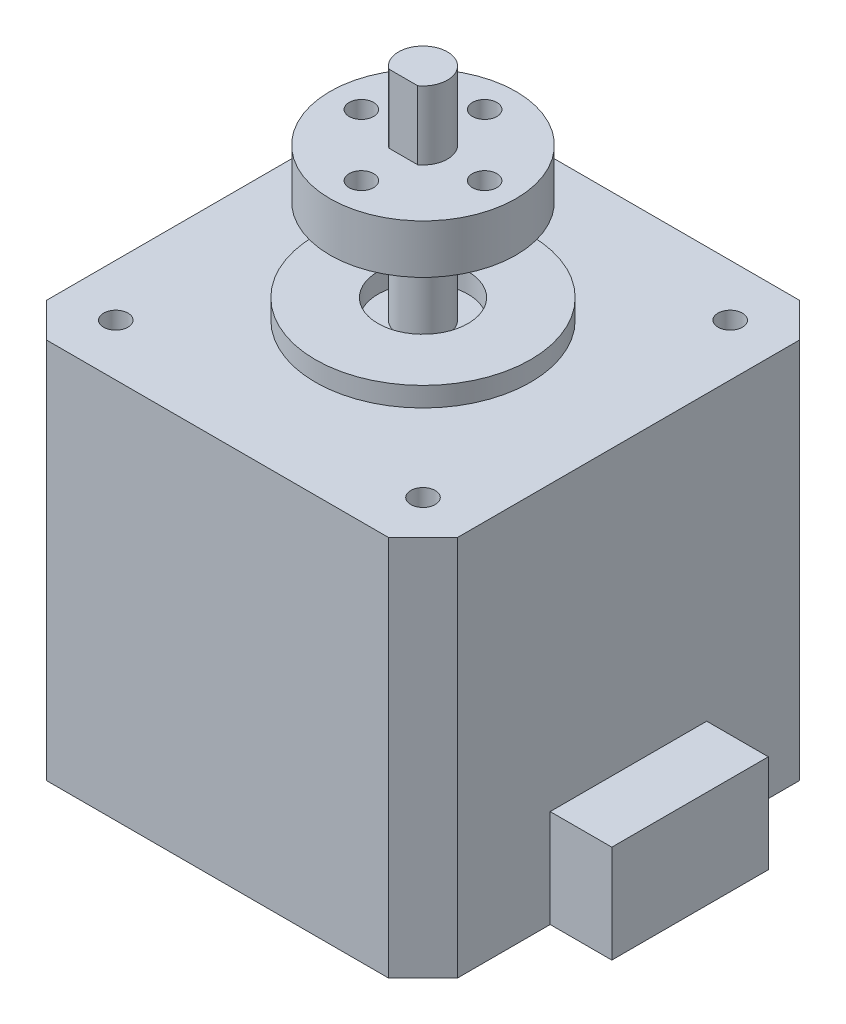
ISO-10303-21;
HEADER;
FILE_DESCRIPTION(('STEP AP214'),'2;1');
FILE_NAME('part.step','',(''),(''),'','','');
FILE_SCHEMA(('AUTOMOTIVE_DESIGN { 1 0 10303 214 1 1 1 1 }'));
ENDSEC;
DATA;
#1=APPLICATION_CONTEXT('core data for automotive mechanical design processes');
#2=APPLICATION_PROTOCOL_DEFINITION('international standard','automotive_design',2000,#1);
#3=PRODUCT_CONTEXT('',#1,'mechanical');
#4=PRODUCT('Part','Part','',(#3));
#5=PRODUCT_RELATED_PRODUCT_CATEGORY('part','',(#4));
#6=PRODUCT_DEFINITION_FORMATION('','',#4);
#7=PRODUCT_DEFINITION_CONTEXT('part definition',#1,'design');
#8=PRODUCT_DEFINITION('design','',#6,#7);
#9=PRODUCT_DEFINITION_SHAPE('','',#8);
#10=(LENGTH_UNIT() NAMED_UNIT(*) SI_UNIT(.MILLI.,.METRE.));
#11=(NAMED_UNIT(*) PLANE_ANGLE_UNIT() SI_UNIT($,.RADIAN.));
#12=(NAMED_UNIT(*) SI_UNIT($,.STERADIAN.) SOLID_ANGLE_UNIT());
#13=UNCERTAINTY_MEASURE_WITH_UNIT(LENGTH_MEASURE(1.E-05),#10,'distance_accuracy_value','');
#14=(GEOMETRIC_REPRESENTATION_CONTEXT(3) GLOBAL_UNCERTAINTY_ASSIGNED_CONTEXT((#13)) GLOBAL_UNIT_ASSIGNED_CONTEXT((#10,
#11,#12)) REPRESENTATION_CONTEXT('',''));
#15=CARTESIAN_POINT('',(0.,0.,0.));
#16=DIRECTION('',(0.,0.,1.));
#17=DIRECTION('',(1.,0.,0.));
#18=AXIS2_PLACEMENT_3D('',#15,#16,#17);
#19=CARTESIAN_POINT('',(42.,39.,-41.0140242480115));
#20=DIRECTION('',(-1.,0.,0.));
#21=DIRECTION('',(0.,0.,1.));
#22=AXIS2_PLACEMENT_3D('',#19,#20,#21);
#23=PLANE('',#22);
#24=DIRECTION('',(0.,-1.,0.));
#25=VECTOR('',#24,1.);
#26=CARTESIAN_POINT('',(42.,0.,-15.5490242480115));
#27=LINE('',#26,#25);
#28=CARTESIAN_POINT('',(42.,10.,-15.5490242480115));
#29=VERTEX_POINT('',#28);
#30=CARTESIAN_POINT('',(42.,0.,-15.5490242480115));
#31=VERTEX_POINT('',#30);
#32=EDGE_CURVE('E51',#29,#31,#27,.T.);
#33=ORIENTED_EDGE('',*,*,#32,.F.);
#34=DIRECTION('',(0.,0.,1.));
#35=VECTOR('',#34,1.);
#36=CARTESIAN_POINT('',(42.,10.,-15.5490242480115));
#37=LINE('',#36,#35);
#38=CARTESIAN_POINT('',(42.,10.,-31.5490242480115));
#39=VERTEX_POINT('',#38);
#40=EDGE_CURVE('E157',#39,#29,#37,.T.);
#41=ORIENTED_EDGE('',*,*,#40,.F.);
#42=DIRECTION('',(0.,1.,0.));
#43=VECTOR('',#42,1.);
#44=CARTESIAN_POINT('',(42.,0.,-31.5490242480115));
#45=LINE('',#44,#43);
#46=CARTESIAN_POINT('',(42.,0.,-31.5490242480115));
#47=VERTEX_POINT('',#46);
#48=EDGE_CURVE('E57',#47,#39,#45,.T.);
#49=ORIENTED_EDGE('',*,*,#48,.F.);
#50=DIRECTION('',(0.,0.,-1.));
#51=VECTOR('',#50,1.);
#52=CARTESIAN_POINT('',(42.,0.,-41.0140242480115));
#53=LINE('',#52,#51);
#54=CARTESIAN_POINT('',(42.,0.,-41.0140242480115));
#55=VERTEX_POINT('',#54);
#56=EDGE_CURVE('E265',#47,#55,#53,.T.);
#57=ORIENTED_EDGE('',*,*,#56,.T.);
#58=DIRECTION('',(0.,-1.,0.));
#59=VECTOR('',#58,1.);
#60=CARTESIAN_POINT('',(42.,39.,-41.0140242480115));
#61=LINE('',#60,#59);
#62=CARTESIAN_POINT('',(42.,39.,-41.0140242480115));
#63=VERTEX_POINT('',#62);
#64=EDGE_CURVE('E291',#63,#55,#61,.T.);
#65=ORIENTED_EDGE('',*,*,#64,.F.);
#66=DIRECTION('',(0.,0.,-1.));
#67=VECTOR('',#66,1.);
#68=CARTESIAN_POINT('',(42.,39.,-41.0140242480115));
#69=LINE('',#68,#67);
#70=CARTESIAN_POINT('',(42.,39.,-6.085092059877));
#71=VERTEX_POINT('',#70);
#72=EDGE_CURVE('E248',#71,#63,#69,.T.);
#73=ORIENTED_EDGE('',*,*,#72,.F.);
#74=DIRECTION('',(0.,-1.,0.));
#75=VECTOR('',#74,1.);
#76=CARTESIAN_POINT('',(42.,39.,-6.085092059877));
#77=LINE('',#76,#75);
#78=CARTESIAN_POINT('',(42.,0.,-6.085092059877));
#79=VERTEX_POINT('',#78);
#80=EDGE_CURVE('E294',#71,#79,#77,.T.);
#81=ORIENTED_EDGE('',*,*,#80,.T.);
#82=EDGE_CURVE('E266',#79,#31,#53,.T.);
#83=ORIENTED_EDGE('',*,*,#82,.T.);
#84=EDGE_LOOP('',(#33,#41,#49,#57,#65,#73,#81,#83));
#85=FACE_BOUND('',#84,.T.);
#86=ADVANCED_FACE('F34',(#85),#23,.F.);
#87=CARTESIAN_POINT('',(38.4644660940673,39.,-2.54955815394427));
#88=DIRECTION('',(0.,0.,-1.));
#89=DIRECTION('',(-1.,0.,0.));
#90=AXIS2_PLACEMENT_3D('',#87,#88,#89);
#91=PLANE('',#90);
#92=DIRECTION('',(1.,0.,0.));
#93=VECTOR('',#92,1.);
#94=CARTESIAN_POINT('',(38.4644660940673,0.,-2.54955815394427));
#95=LINE('',#94,#93);
#96=CARTESIAN_POINT('',(3.53553390593273,0.,-2.54955815394426));
#97=VERTEX_POINT('',#96);
#98=CARTESIAN_POINT('',(38.4644660940673,0.,-2.54955815394427));
#99=VERTEX_POINT('',#98);
#100=EDGE_CURVE('E239',#97,#99,#95,.T.);
#101=ORIENTED_EDGE('',*,*,#100,.T.);
#102=DIRECTION('',(0.,-1.,0.));
#103=VECTOR('',#102,1.);
#104=CARTESIAN_POINT('',(38.4644660940673,39.,-2.54955815394427));
#105=LINE('',#104,#103);
#106=CARTESIAN_POINT('',(38.4644660940673,39.,-2.54955815394427));
#107=VERTEX_POINT('',#106);
#108=EDGE_CURVE('E297',#107,#99,#105,.T.);
#109=ORIENTED_EDGE('',*,*,#108,.F.);
#110=DIRECTION('',(1.,0.,0.));
#111=VECTOR('',#110,1.);
#112=CARTESIAN_POINT('',(38.4644660940673,39.,-2.54955815394427));
#113=LINE('',#112,#111);
#114=CARTESIAN_POINT('',(3.53553390593273,39.,-2.54955815394426));
#115=VERTEX_POINT('',#114);
#116=EDGE_CURVE('E242',#115,#107,#113,.T.);
#117=ORIENTED_EDGE('',*,*,#116,.F.);
#118=DIRECTION('',(0.,-1.,0.));
#119=VECTOR('',#118,1.);
#120=CARTESIAN_POINT('',(3.53553390593273,39.,-2.54955815394426));
#121=LINE('',#120,#119);
#122=EDGE_CURVE('E260',#115,#97,#121,.T.);
#123=ORIENTED_EDGE('',*,*,#122,.T.);
#124=EDGE_LOOP('',(#101,#109,#117,#123));
#125=FACE_BOUND('',#124,.T.);
#126=ADVANCED_FACE('F36',(#125),#91,.F.);
#127=CARTESIAN_POINT('',(42.,39.,-6.085092059877));
#128=DIRECTION('',(-0.707106781186547,0.,-0.707106781186548));
#129=DIRECTION('',(-0.707106781186548,0.,0.707106781186547));
#130=AXIS2_PLACEMENT_3D('',#127,#128,#129);
#131=PLANE('',#130);
#132=DIRECTION('',(0.707106781186548,0.,-0.707106781186547));
#133=VECTOR('',#132,1.);
#134=CARTESIAN_POINT('',(42.,0.,-6.085092059877));
#135=LINE('',#134,#133);
#136=EDGE_CURVE('E263',#99,#79,#135,.T.);
#137=ORIENTED_EDGE('',*,*,#136,.T.);
#138=ORIENTED_EDGE('',*,*,#80,.F.);
#139=DIRECTION('',(0.707106781186548,0.,-0.707106781186547));
#140=VECTOR('',#139,1.);
#141=CARTESIAN_POINT('',(42.,39.,-6.085092059877));
#142=LINE('',#141,#140);
#143=EDGE_CURVE('E245',#107,#71,#142,.T.);
#144=ORIENTED_EDGE('',*,*,#143,.F.);
#145=ORIENTED_EDGE('',*,*,#108,.T.);
#146=EDGE_LOOP('',(#137,#138,#144,#145));
#147=FACE_BOUND('',#146,.T.);
#148=ADVANCED_FACE('F338',(#147),#131,.F.);
#149=CARTESIAN_POINT('',(38.4644660940673,39.,-44.5495581539443));
#150=DIRECTION('',(-0.707106781186549,0.,0.707106781186546));
#151=DIRECTION('',(0.707106781186546,0.,0.707106781186549));
#152=AXIS2_PLACEMENT_3D('',#149,#150,#151);
#153=PLANE('',#152);
#154=DIRECTION('',(-0.707106781186546,0.,-0.707106781186549));
#155=VECTOR('',#154,1.);
#156=CARTESIAN_POINT('',(38.4644660940673,0.,-44.5495581539443));
#157=LINE('',#156,#155);
#158=CARTESIAN_POINT('',(38.4644660940673,0.,-44.5495581539443));
#159=VERTEX_POINT('',#158);
#160=EDGE_CURVE('E268',#55,#159,#157,.T.);
#161=ORIENTED_EDGE('',*,*,#160,.T.);
#162=DIRECTION('',(0.,-1.,0.));
#163=VECTOR('',#162,1.);
#164=CARTESIAN_POINT('',(38.4644660940673,39.,-44.5495581539443));
#165=LINE('',#164,#163);
#166=CARTESIAN_POINT('',(38.4644660940673,39.,-44.5495581539443));
#167=VERTEX_POINT('',#166);
#168=EDGE_CURVE('E288',#167,#159,#165,.T.);
#169=ORIENTED_EDGE('',*,*,#168,.F.);
#170=DIRECTION('',(-0.707106781186546,0.,-0.707106781186549));
#171=VECTOR('',#170,1.);
#172=CARTESIAN_POINT('',(38.4644660940673,39.,-44.5495581539443));
#173=LINE('',#172,#171);
#174=EDGE_CURVE('E250',#63,#167,#173,.T.);
#175=ORIENTED_EDGE('',*,*,#174,.F.);
#176=ORIENTED_EDGE('',*,*,#64,.T.);
#177=EDGE_LOOP('',(#161,#169,#175,#176));
#178=FACE_BOUND('',#177,.T.);
#179=ADVANCED_FACE('F341',(#178),#153,.F.);
#180=CARTESIAN_POINT('',(3.53553390593274,39.,-44.5495581539443));
#181=DIRECTION('',(0.,0.,1.));
#182=DIRECTION('',(1.,0.,0.));
#183=AXIS2_PLACEMENT_3D('',#180,#181,#182);
#184=PLANE('',#183);
#185=DIRECTION('',(-1.,0.,0.));
#186=VECTOR('',#185,1.);
#187=CARTESIAN_POINT('',(3.53553390593274,0.,-44.5495581539443));
#188=LINE('',#187,#186);
#189=CARTESIAN_POINT('',(3.53553390593274,0.,-44.5495581539443));
#190=VERTEX_POINT('',#189);
#191=EDGE_CURVE('E270',#159,#190,#188,.T.);
#192=ORIENTED_EDGE('',*,*,#191,.T.);
#193=DIRECTION('',(0.,-1.,0.));
#194=VECTOR('',#193,1.);
#195=CARTESIAN_POINT('',(3.53553390593274,39.,-44.5495581539443));
#196=LINE('',#195,#194);
#197=CARTESIAN_POINT('',(3.53553390593274,39.,-44.5495581539443));
#198=VERTEX_POINT('',#197);
#199=EDGE_CURVE('E285',#198,#190,#196,.T.);
#200=ORIENTED_EDGE('',*,*,#199,.F.);
#201=DIRECTION('',(-1.,0.,0.));
#202=VECTOR('',#201,1.);
#203=CARTESIAN_POINT('',(3.53553390593274,39.,-44.5495581539443));
#204=LINE('',#203,#202);
#205=EDGE_CURVE('E252',#167,#198,#204,.T.);
#206=ORIENTED_EDGE('',*,*,#205,.F.);
#207=ORIENTED_EDGE('',*,*,#168,.T.);
#208=EDGE_LOOP('',(#192,#200,#206,#207));
#209=FACE_BOUND('',#208,.T.);
#210=ADVANCED_FACE('F348',(#209),#184,.F.);
#211=CARTESIAN_POINT('',(0.,39.,-41.0140242480115));
#212=DIRECTION('',(0.707106781186546,0.,0.707106781186549));
#213=DIRECTION('',(0.707106781186549,0.,-0.707106781186546));
#214=AXIS2_PLACEMENT_3D('',#211,#212,#213);
#215=PLANE('',#214);
#216=DIRECTION('',(-0.707106781186549,0.,0.707106781186546));
#217=VECTOR('',#216,1.);
#218=CARTESIAN_POINT('',(0.,0.,-41.0140242480115));
#219=LINE('',#218,#217);
#220=CARTESIAN_POINT('',(0.,0.,-41.0140242480115));
#221=VERTEX_POINT('',#220);
#222=EDGE_CURVE('E272',#190,#221,#219,.T.);
#223=ORIENTED_EDGE('',*,*,#222,.T.);
#224=DIRECTION('',(0.,-1.,0.));
#225=VECTOR('',#224,1.);
#226=CARTESIAN_POINT('',(0.,39.,-41.0140242480115));
#227=LINE('',#226,#225);
#228=CARTESIAN_POINT('',(0.,39.,-41.0140242480115));
#229=VERTEX_POINT('',#228);
#230=EDGE_CURVE('E282',#229,#221,#227,.T.);
#231=ORIENTED_EDGE('',*,*,#230,.F.);
#232=DIRECTION('',(-0.707106781186549,0.,0.707106781186546));
#233=VECTOR('',#232,1.);
#234=CARTESIAN_POINT('',(0.,39.,-41.0140242480115));
#235=LINE('',#234,#233);
#236=EDGE_CURVE('E254',#198,#229,#235,.T.);
#237=ORIENTED_EDGE('',*,*,#236,.F.);
#238=ORIENTED_EDGE('',*,*,#199,.T.);
#239=EDGE_LOOP('',(#223,#231,#237,#238));
#240=FACE_BOUND('',#239,.T.);
#241=ADVANCED_FACE('F373',(#240),#215,.F.);
#242=CARTESIAN_POINT('',(0.,39.,-6.085092059877));
#243=DIRECTION('',(1.,0.,0.));
#244=DIRECTION('',(0.,0.,-1.));
#245=AXIS2_PLACEMENT_3D('',#242,#243,#244);
#246=PLANE('',#245);
#247=DIRECTION('',(0.,0.,1.));
#248=VECTOR('',#247,1.);
#249=CARTESIAN_POINT('',(0.,0.,-6.085092059877));
#250=LINE('',#249,#248);
#251=CARTESIAN_POINT('',(0.,0.,-6.085092059877));
#252=VERTEX_POINT('',#251);
#253=EDGE_CURVE('E274',#221,#252,#250,.T.);
#254=ORIENTED_EDGE('',*,*,#253,.T.);
#255=DIRECTION('',(0.,-1.,0.));
#256=VECTOR('',#255,1.);
#257=CARTESIAN_POINT('',(0.,39.,-6.085092059877));
#258=LINE('',#257,#256);
#259=CARTESIAN_POINT('',(0.,39.,-6.085092059877));
#260=VERTEX_POINT('',#259);
#261=EDGE_CURVE('E279',#260,#252,#258,.T.);
#262=ORIENTED_EDGE('',*,*,#261,.F.);
#263=DIRECTION('',(0.,0.,1.));
#264=VECTOR('',#263,1.);
#265=CARTESIAN_POINT('',(0.,39.,-6.085092059877));
#266=LINE('',#265,#264);
#267=EDGE_CURVE('E256',#229,#260,#266,.T.);
#268=ORIENTED_EDGE('',*,*,#267,.F.);
#269=ORIENTED_EDGE('',*,*,#230,.T.);
#270=EDGE_LOOP('',(#254,#262,#268,#269));
#271=FACE_BOUND('',#270,.T.);
#272=ADVANCED_FACE('F369',(#271),#246,.F.);
#273=CARTESIAN_POINT('',(3.53553390593273,39.,-2.54955815394426));
#274=DIRECTION('',(0.707106781186549,0.,-0.707106781186546));
#275=DIRECTION('',(-0.707106781186546,0.,-0.707106781186549));
#276=AXIS2_PLACEMENT_3D('',#273,#274,#275);
#277=PLANE('',#276);
#278=DIRECTION('',(0.707106781186546,0.,0.707106781186549));
#279=VECTOR('',#278,1.);
#280=CARTESIAN_POINT('',(3.53553390593273,0.,-2.54955815394426));
#281=LINE('',#280,#279);
#282=EDGE_CURVE('E246',#252,#97,#281,.T.);
#283=ORIENTED_EDGE('',*,*,#282,.T.);
#284=ORIENTED_EDGE('',*,*,#122,.F.);
#285=DIRECTION('',(0.707106781186546,0.,0.707106781186549));
#286=VECTOR('',#285,1.);
#287=CARTESIAN_POINT('',(3.53553390593273,39.,-2.54955815394426));
#288=LINE('',#287,#286);
#289=EDGE_CURVE('E258',#260,#115,#288,.T.);
#290=ORIENTED_EDGE('',*,*,#289,.F.);
#291=ORIENTED_EDGE('',*,*,#261,.T.);
#292=EDGE_LOOP('',(#283,#284,#290,#291));
#293=FACE_BOUND('',#292,.T.);
#294=ADVANCED_FACE('F365',(#293),#277,.F.);
#295=CARTESIAN_POINT('',(0.,39.,0.));
#296=DIRECTION('',(0.,-1.,0.));
#297=DIRECTION('',(0.,0.,-1.));
#298=AXIS2_PLACEMENT_3D('',#295,#296,#297);
#299=PLANE('',#298);
#300=CARTESIAN_POINT('',(21.,39.,-23.5495581539443));
#301=DIRECTION('',(0.,-1.,0.));
#302=DIRECTION('',(0.,0.,-1.));
#303=AXIS2_PLACEMENT_3D('',#300,#301,#302);
#304=CIRCLE('',#303,11.);
#305=CARTESIAN_POINT('',(21.,39.,-34.5495581539443));
#306=VERTEX_POINT('',#305);
#307=EDGE_CURVE('E43',#306,#306,#304,.F.);
#308=ORIENTED_EDGE('',*,*,#307,.F.);
#309=EDGE_LOOP('',(#308));
#310=FACE_BOUND('',#309,.T.);
#311=CARTESIAN_POINT('',(5.3,39.,-7.84955815394426));
#312=DIRECTION('',(0.,1.,0.));
#313=DIRECTION('',(0.,0.,1.));
#314=AXIS2_PLACEMENT_3D('',#311,#312,#313);
#315=CIRCLE('',#314,1.25);
#316=CARTESIAN_POINT('',(5.3,39.,-6.59955815394426));
#317=VERTEX_POINT('',#316);
#318=EDGE_CURVE('E217',#317,#317,#315,.T.);
#319=ORIENTED_EDGE('',*,*,#318,.F.);
#320=EDGE_LOOP('',(#319));
#321=FACE_BOUND('',#320,.T.);
#322=CARTESIAN_POINT('',(36.7,39.,-7.84955815394426));
#323=DIRECTION('',(0.,1.,0.));
#324=DIRECTION('',(0.,0.,1.));
#325=AXIS2_PLACEMENT_3D('',#322,#323,#324);
#326=CIRCLE('',#325,1.25);
#327=CARTESIAN_POINT('',(36.7,39.,-6.59955815394426));
#328=VERTEX_POINT('',#327);
#329=EDGE_CURVE('E228',#328,#328,#326,.T.);
#330=ORIENTED_EDGE('',*,*,#329,.F.);
#331=EDGE_LOOP('',(#330));
#332=FACE_BOUND('',#331,.T.);
#333=CARTESIAN_POINT('',(36.7,39.,-39.2495581539443));
#334=DIRECTION('',(0.,1.,0.));
#335=DIRECTION('',(0.,0.,1.));
#336=AXIS2_PLACEMENT_3D('',#333,#334,#335);
#337=CIRCLE('',#336,1.25);
#338=CARTESIAN_POINT('',(36.7,39.,-37.9995581539443));
#339=VERTEX_POINT('',#338);
#340=EDGE_CURVE('E222',#339,#339,#337,.T.);
#341=ORIENTED_EDGE('',*,*,#340,.F.);
#342=EDGE_LOOP('',(#341));
#343=FACE_BOUND('',#342,.T.);
#344=CARTESIAN_POINT('',(5.3,39.,-39.2495581539443));
#345=DIRECTION('',(0.,1.,0.));
#346=DIRECTION('',(0.,0.,1.));
#347=AXIS2_PLACEMENT_3D('',#344,#345,#346);
#348=CIRCLE('',#347,1.25);
#349=CARTESIAN_POINT('',(5.3,39.,-37.9995581539443));
#350=VERTEX_POINT('',#349);
#351=EDGE_CURVE('E221',#350,#350,#348,.T.);
#352=ORIENTED_EDGE('',*,*,#351,.F.);
#353=EDGE_LOOP('',(#352));
#354=FACE_BOUND('',#353,.T.);
#355=ORIENTED_EDGE('',*,*,#116,.T.);
#356=ORIENTED_EDGE('',*,*,#143,.T.);
#357=ORIENTED_EDGE('',*,*,#72,.T.);
#358=ORIENTED_EDGE('',*,*,#174,.T.);
#359=ORIENTED_EDGE('',*,*,#205,.T.);
#360=ORIENTED_EDGE('',*,*,#236,.T.);
#361=ORIENTED_EDGE('',*,*,#267,.T.);
#362=ORIENTED_EDGE('',*,*,#289,.T.);
#363=EDGE_LOOP('',(#355,#356,#357,#358,#359,#360,#361,#362));
#364=FACE_BOUND('',#363,.T.);
#365=ADVANCED_FACE('F356',(#310,#321,#332,#343,#354,#364),#299,.F.);
#366=CARTESIAN_POINT('',(0.,0.,0.));
#367=DIRECTION('',(0.,-1.,0.));
#368=DIRECTION('',(0.,0.,-1.));
#369=AXIS2_PLACEMENT_3D('',#366,#367,#368);
#370=PLANE('',#369);
#371=CARTESIAN_POINT('',(5.3,0.,-7.84955815394426));
#372=DIRECTION('',(0.,1.,0.));
#373=DIRECTION('',(0.,0.,1.));
#374=AXIS2_PLACEMENT_3D('',#371,#372,#373);
#375=CIRCLE('',#374,1.25);
#376=CARTESIAN_POINT('',(5.3,0.,-6.59955815394426));
#377=VERTEX_POINT('',#376);
#378=EDGE_CURVE('E231',#377,#377,#375,.T.);
#379=ORIENTED_EDGE('',*,*,#378,.T.);
#380=EDGE_LOOP('',(#379));
#381=FACE_BOUND('',#380,.T.);
#382=CARTESIAN_POINT('',(36.7,0.,-7.84955815394426));
#383=DIRECTION('',(0.,1.,0.));
#384=DIRECTION('',(0.,0.,1.));
#385=AXIS2_PLACEMENT_3D('',#382,#383,#384);
#386=CIRCLE('',#385,1.25);
#387=CARTESIAN_POINT('',(36.7,0.,-6.59955815394426));
#388=VERTEX_POINT('',#387);
#389=EDGE_CURVE('E225',#388,#388,#386,.T.);
#390=ORIENTED_EDGE('',*,*,#389,.T.);
#391=EDGE_LOOP('',(#390));
#392=FACE_BOUND('',#391,.T.);
#393=CARTESIAN_POINT('',(36.7,0.,-39.2495581539443));
#394=DIRECTION('',(0.,1.,0.));
#395=DIRECTION('',(0.,0.,1.));
#396=AXIS2_PLACEMENT_3D('',#393,#394,#395);
#397=CIRCLE('',#396,1.25);
#398=CARTESIAN_POINT('',(36.7,0.,-37.9995581539443));
#399=VERTEX_POINT('',#398);
#400=EDGE_CURVE('E218',#399,#399,#397,.T.);
#401=ORIENTED_EDGE('',*,*,#400,.T.);
#402=EDGE_LOOP('',(#401));
#403=FACE_BOUND('',#402,.T.);
#404=CARTESIAN_POINT('',(5.3,0.,-39.2495581539443));
#405=DIRECTION('',(0.,1.,0.));
#406=DIRECTION('',(0.,0.,1.));
#407=AXIS2_PLACEMENT_3D('',#404,#405,#406);
#408=CIRCLE('',#407,1.25);
#409=CARTESIAN_POINT('',(5.3,0.,-37.9995581539443));
#410=VERTEX_POINT('',#409);
#411=EDGE_CURVE('E236',#410,#410,#408,.T.);
#412=ORIENTED_EDGE('',*,*,#411,.T.);
#413=EDGE_LOOP('',(#412));
#414=FACE_BOUND('',#413,.T.);
#415=ORIENTED_EDGE('',*,*,#100,.F.);
#416=ORIENTED_EDGE('',*,*,#282,.F.);
#417=ORIENTED_EDGE('',*,*,#253,.F.);
#418=ORIENTED_EDGE('',*,*,#222,.F.);
#419=ORIENTED_EDGE('',*,*,#191,.F.);
#420=ORIENTED_EDGE('',*,*,#160,.F.);
#421=ORIENTED_EDGE('',*,*,#56,.F.);
#422=DIRECTION('',(-1.,0.,0.));
#423=VECTOR('',#422,1.);
#424=CARTESIAN_POINT('',(48.3,0.,-31.5490242480115));
#425=LINE('',#424,#423);
#426=CARTESIAN_POINT('',(48.3,0.,-31.5490242480115));
#427=VERTEX_POINT('',#426);
#428=EDGE_CURVE('E144',#427,#47,#425,.T.);
#429=ORIENTED_EDGE('',*,*,#428,.F.);
#430=DIRECTION('',(0.,0.,-1.));
#431=VECTOR('',#430,1.);
#432=CARTESIAN_POINT('',(48.3,0.,-15.5490242480115));
#433=LINE('',#432,#431);
#434=CARTESIAN_POINT('',(48.3,0.,-15.5490242480115));
#435=VERTEX_POINT('',#434);
#436=EDGE_CURVE('E136',#435,#427,#433,.T.);
#437=ORIENTED_EDGE('',*,*,#436,.F.);
#438=DIRECTION('',(-1.,0.,0.));
#439=VECTOR('',#438,1.);
#440=CARTESIAN_POINT('',(48.3,0.,-15.5490242480115));
#441=LINE('',#440,#439);
#442=EDGE_CURVE('E142',#435,#31,#441,.T.);
#443=ORIENTED_EDGE('',*,*,#442,.T.);
#444=ORIENTED_EDGE('',*,*,#82,.F.);
#445=ORIENTED_EDGE('',*,*,#136,.F.);
#446=EDGE_LOOP('',(#415,#416,#417,#418,#419,#420,#421,#429,#437,#443,#444,#445));
#447=FACE_BOUND('',#446,.T.);
#448=ADVANCED_FACE('F139',(#381,#392,#403,#414,#447),#370,.T.);
#449=CARTESIAN_POINT('',(5.3,0.,-39.2495581539443));
#450=DIRECTION('',(0.,1.,0.));
#451=DIRECTION('',(0.,0.,1.));
#452=AXIS2_PLACEMENT_3D('',#449,#450,#451);
#453=CYLINDRICAL_SURFACE('',#452,1.25);
#454=ORIENTED_EDGE('',*,*,#411,.F.);
#455=EDGE_LOOP('',(#454));
#456=FACE_BOUND('',#455,.T.);
#457=ORIENTED_EDGE('',*,*,#351,.T.);
#458=EDGE_LOOP('',(#457));
#459=FACE_BOUND('',#458,.T.);
#460=ADVANCED_FACE('F391',(#456,#459),#453,.F.);
#461=CARTESIAN_POINT('',(36.7,0.,-39.2495581539443));
#462=DIRECTION('',(0.,1.,0.));
#463=DIRECTION('',(0.,0.,1.));
#464=AXIS2_PLACEMENT_3D('',#461,#462,#463);
#465=CYLINDRICAL_SURFACE('',#464,1.25);
#466=ORIENTED_EDGE('',*,*,#400,.F.);
#467=EDGE_LOOP('',(#466));
#468=FACE_BOUND('',#467,.T.);
#469=ORIENTED_EDGE('',*,*,#340,.T.);
#470=EDGE_LOOP('',(#469));
#471=FACE_BOUND('',#470,.T.);
#472=ADVANCED_FACE('F399',(#468,#471),#465,.F.);
#473=CARTESIAN_POINT('',(36.7,0.,-7.84955815394426));
#474=DIRECTION('',(0.,1.,0.));
#475=DIRECTION('',(0.,0.,1.));
#476=AXIS2_PLACEMENT_3D('',#473,#474,#475);
#477=CYLINDRICAL_SURFACE('',#476,1.25);
#478=ORIENTED_EDGE('',*,*,#389,.F.);
#479=EDGE_LOOP('',(#478));
#480=FACE_BOUND('',#479,.T.);
#481=ORIENTED_EDGE('',*,*,#329,.T.);
#482=EDGE_LOOP('',(#481));
#483=FACE_BOUND('',#482,.T.);
#484=ADVANCED_FACE('F405',(#480,#483),#477,.F.);
#485=CARTESIAN_POINT('',(5.3,0.,-7.84955815394426));
#486=DIRECTION('',(0.,1.,0.));
#487=DIRECTION('',(0.,0.,1.));
#488=AXIS2_PLACEMENT_3D('',#485,#486,#487);
#489=CYLINDRICAL_SURFACE('',#488,1.25);
#490=ORIENTED_EDGE('',*,*,#378,.F.);
#491=EDGE_LOOP('',(#490));
#492=FACE_BOUND('',#491,.T.);
#493=ORIENTED_EDGE('',*,*,#318,.T.);
#494=EDGE_LOOP('',(#493));
#495=FACE_BOUND('',#494,.T.);
#496=ADVANCED_FACE('F401',(#492,#495),#489,.F.);
#497=CARTESIAN_POINT('',(21.,41.,-23.5495581539443));
#498=DIRECTION('',(0.,1.,0.));
#499=DIRECTION('',(0.,0.,1.));
#500=AXIS2_PLACEMENT_3D('',#497,#498,#499);
#501=PLANE('',#500);
#502=CARTESIAN_POINT('',(21.,41.,-23.5495581539443));
#503=DIRECTION('',(0.,1.,0.));
#504=DIRECTION('',(0.,0.,1.));
#505=AXIS2_PLACEMENT_3D('',#502,#503,#504);
#506=CIRCLE('',#505,11.);
#507=CARTESIAN_POINT('',(21.,41.,-12.5495581539443));
#508=VERTEX_POINT('',#507);
#509=EDGE_CURVE('E212',#508,#508,#506,.T.);
#510=ORIENTED_EDGE('',*,*,#509,.T.);
#511=EDGE_LOOP('',(#510));
#512=FACE_BOUND('',#511,.T.);
#513=CARTESIAN_POINT('',(21.,41.,-23.5495581539443));
#514=DIRECTION('',(0.,1.,0.));
#515=DIRECTION('',(0.,0.,1.));
#516=AXIS2_PLACEMENT_3D('',#513,#514,#515);
#517=CIRCLE('',#516,4.6);
#518=CARTESIAN_POINT('',(21.,41.,-18.9495581539443));
#519=VERTEX_POINT('',#518);
#520=EDGE_CURVE('E209',#519,#519,#517,.T.);
#521=ORIENTED_EDGE('',*,*,#520,.F.);
#522=EDGE_LOOP('',(#521));
#523=FACE_BOUND('',#522,.T.);
#524=ADVANCED_FACE('F404',(#512,#523),#501,.T.);
#525=CARTESIAN_POINT('',(21.,41.,-23.5495581539443));
#526=DIRECTION('',(0.,-1.,0.));
#527=DIRECTION('',(0.,0.,-1.));
#528=AXIS2_PLACEMENT_3D('',#525,#526,#527);
#529=CYLINDRICAL_SURFACE('',#528,11.);
#530=ORIENTED_EDGE('',*,*,#509,.F.);
#531=EDGE_LOOP('',(#530));
#532=FACE_BOUND('',#531,.T.);
#533=ORIENTED_EDGE('',*,*,#307,.T.);
#534=EDGE_LOOP('',(#533));
#535=FACE_BOUND('',#534,.T.);
#536=ADVANCED_FACE('F413',(#532,#535),#529,.T.);
#537=CARTESIAN_POINT('',(21.,41.,-23.5495581539443));
#538=DIRECTION('',(0.,-1.,0.));
#539=DIRECTION('',(0.,0.,-1.));
#540=AXIS2_PLACEMENT_3D('',#537,#538,#539);
#541=CYLINDRICAL_SURFACE('',#540,4.6);
#542=ORIENTED_EDGE('',*,*,#520,.T.);
#543=EDGE_LOOP('',(#542));
#544=FACE_BOUND('',#543,.T.);
#545=CARTESIAN_POINT('',(21.,39.,-23.5495581539443));
#546=DIRECTION('',(0.,1.,0.));
#547=DIRECTION('',(0.,0.,1.));
#548=AXIS2_PLACEMENT_3D('',#545,#546,#547);
#549=CIRCLE('',#548,4.6);
#550=CARTESIAN_POINT('',(21.,39.,-18.9495581539443));
#551=VERTEX_POINT('',#550);
#552=EDGE_CURVE('E208',#551,#551,#549,.T.);
#553=ORIENTED_EDGE('',*,*,#552,.F.);
#554=EDGE_LOOP('',(#553));
#555=FACE_BOUND('',#554,.T.);
#556=ADVANCED_FACE('F416',(#544,#555),#541,.F.);
#557=CARTESIAN_POINT('',(21.,39.,-23.5495581539443));
#558=DIRECTION('',(0.,-1.,0.));
#559=DIRECTION('',(0.,0.,-1.));
#560=AXIS2_PLACEMENT_3D('',#557,#558,#559);
#561=CIRCLE('',#560,2.5);
#562=CARTESIAN_POINT('',(21.,39.,-26.0495581539443));
#563=VERTEX_POINT('',#562);
#564=EDGE_CURVE('E11',#563,#563,#561,.F.);
#565=ORIENTED_EDGE('',*,*,#564,.F.);
#566=EDGE_LOOP('',(#565));
#567=FACE_BOUND('',#566,.T.);
#568=ORIENTED_EDGE('',*,*,#552,.T.);
#569=EDGE_LOOP('',(#568));
#570=FACE_BOUND('',#569,.T.);
#571=ADVANCED_FACE('F396',(#567,#570),#299,.F.);
#572=CARTESIAN_POINT('',(21.,61.5,-23.5495581539443));
#573=DIRECTION('',(0.,-1.,0.));
#574=DIRECTION('',(0.,0.,-1.));
#575=AXIS2_PLACEMENT_3D('',#572,#573,#574);
#576=CYLINDRICAL_SURFACE('',#575,2.5);
#577=CARTESIAN_POINT('',(21.,49.5,-23.5495581539443));
#578=DIRECTION('',(0.,-1.,0.));
#579=DIRECTION('',(0.,0.,-1.));
#580=AXIS2_PLACEMENT_3D('',#577,#578,#579);
#581=CIRCLE('',#580,2.5);
#582=CARTESIAN_POINT('',(21.,49.5,-26.0495581539443));
#583=VERTEX_POINT('',#582);
#584=EDGE_CURVE('E204',#583,#583,#581,.T.);
#585=CARTESIAN_POINT('',(21.,49.5,-26.0495581539443));
#586=CARTESIAN_POINT('',(21.,49.390625,-26.0495581539443));
#587=CARTESIAN_POINT('',(21.,49.28125,-26.0495581539443));
#588=CARTESIAN_POINT('',(21.,49.0625,-26.0495581539443));
#589=CARTESIAN_POINT('',(21.,48.953125,-26.0495581539443));
#590=CARTESIAN_POINT('',(21.,48.734375,-26.0495581539443));
#591=CARTESIAN_POINT('',(21.,48.625,-26.0495581539443));
#592=CARTESIAN_POINT('',(21.,48.40625,-26.0495581539443));
#593=CARTESIAN_POINT('',(21.,48.296875,-26.0495581539443));
#594=CARTESIAN_POINT('',(21.,48.078125,-26.0495581539443));
#595=CARTESIAN_POINT('',(21.,47.96875,-26.0495581539443));
#596=CARTESIAN_POINT('',(21.,47.75,-26.0495581539443));
#597=CARTESIAN_POINT('',(21.,47.640625,-26.0495581539443));
#598=CARTESIAN_POINT('',(21.,47.421875,-26.0495581539443));
#599=CARTESIAN_POINT('',(21.,47.3125,-26.0495581539443));
#600=CARTESIAN_POINT('',(21.,47.09375,-26.0495581539443));
#601=CARTESIAN_POINT('',(21.,46.984375,-26.0495581539443));
#602=CARTESIAN_POINT('',(21.,46.765625,-26.0495581539443));
#603=CARTESIAN_POINT('',(21.,46.65625,-26.0495581539443));
#604=CARTESIAN_POINT('',(21.,46.4375,-26.0495581539443));
#605=CARTESIAN_POINT('',(21.,46.328125,-26.0495581539443));
#606=CARTESIAN_POINT('',(21.,46.109375,-26.0495581539443));
#607=CARTESIAN_POINT('',(21.,46.,-26.0495581539443));
#608=CARTESIAN_POINT('',(21.,45.78125,-26.0495581539443));
#609=CARTESIAN_POINT('',(21.,45.671875,-26.0495581539443));
#610=CARTESIAN_POINT('',(21.,45.453125,-26.0495581539443));
#611=CARTESIAN_POINT('',(21.,45.34375,-26.0495581539443));
#612=CARTESIAN_POINT('',(21.,45.125,-26.0495581539443));
#613=CARTESIAN_POINT('',(21.,45.015625,-26.0495581539443));
#614=CARTESIAN_POINT('',(21.,44.796875,-26.0495581539443));
#615=CARTESIAN_POINT('',(21.,44.6875,-26.0495581539443));
#616=CARTESIAN_POINT('',(21.,44.46875,-26.0495581539443));
#617=CARTESIAN_POINT('',(21.,44.359375,-26.0495581539443));
#618=CARTESIAN_POINT('',(21.,44.140625,-26.0495581539443));
#619=CARTESIAN_POINT('',(21.,44.03125,-26.0495581539443));
#620=CARTESIAN_POINT('',(21.,43.8125,-26.0495581539443));
#621=CARTESIAN_POINT('',(21.,43.703125,-26.0495581539443));
#622=CARTESIAN_POINT('',(21.,43.484375,-26.0495581539443));
#623=CARTESIAN_POINT('',(21.,43.375,-26.0495581539443));
#624=CARTESIAN_POINT('',(21.,43.15625,-26.0495581539443));
#625=CARTESIAN_POINT('',(21.,43.046875,-26.0495581539443));
#626=CARTESIAN_POINT('',(21.,42.828125,-26.0495581539443));
#627=CARTESIAN_POINT('',(21.,42.71875,-26.0495581539443));
#628=CARTESIAN_POINT('',(21.,42.5,-26.0495581539443));
#629=CARTESIAN_POINT('',(21.,42.390625,-26.0495581539443));
#630=CARTESIAN_POINT('',(21.,42.171875,-26.0495581539443));
#631=CARTESIAN_POINT('',(21.,42.0625,-26.0495581539443));
#632=CARTESIAN_POINT('',(21.,41.84375,-26.0495581539443));
#633=CARTESIAN_POINT('',(21.,41.734375,-26.0495581539443));
#634=CARTESIAN_POINT('',(21.,41.515625,-26.0495581539443));
#635=CARTESIAN_POINT('',(21.,41.40625,-26.0495581539443));
#636=CARTESIAN_POINT('',(21.,41.1875,-26.0495581539443));
#637=CARTESIAN_POINT('',(21.,41.078125,-26.0495581539443));
#638=CARTESIAN_POINT('',(21.,40.859375,-26.0495581539443));
#639=CARTESIAN_POINT('',(21.,40.75,-26.0495581539443));
#640=CARTESIAN_POINT('',(21.,40.53125,-26.0495581539443));
#641=CARTESIAN_POINT('',(21.,40.421875,-26.0495581539443));
#642=CARTESIAN_POINT('',(21.,40.203125,-26.0495581539443));
#643=CARTESIAN_POINT('',(21.,40.09375,-26.0495581539443));
#644=CARTESIAN_POINT('',(21.,39.875,-26.0495581539443));
#645=CARTESIAN_POINT('',(21.,39.765625,-26.0495581539443));
#646=CARTESIAN_POINT('',(21.,39.546875,-26.0495581539443));
#647=CARTESIAN_POINT('',(21.,39.4375,-26.0495581539443));
#648=CARTESIAN_POINT('',(21.,39.21875,-26.0495581539443));
#649=CARTESIAN_POINT('',(21.,39.109375,-26.0495581539443));
#650=CARTESIAN_POINT('',(21.,39.,-26.0495581539443));
#651=B_SPLINE_CURVE_WITH_KNOTS('',3,(#585,#586,#587,#588,#589,#590,#591,#592,#593,#594,#595,
#596,#597,#598,#599,#600,#601,#602,#603,#604,#605,#606,#607,#608,#609,#610,#611,#612,#613,#614,
#615,#616,#617,#618,#619,#620,#621,#622,#623,#624,#625,#626,#627,#628,#629,#630,#631,#632,#633,
#634,#635,#636,#637,#638,#639,#640,#641,#642,#643,#644,#645,#646,#647,#648,#649,#650),
.UNSPECIFIED.,.F.,.F.,(4,2,2,2,2,2,2,2,2,2,2,2,2,2,2,2,2,2,2,2,2,2,2,2,2,2,2,2,2,2,2,2,4),(0.,
0.328125000000005,0.656250000000004,0.984375000000003,1.3125,1.640625,1.96875000000001,2.296875,
2.625,2.953125,3.28125000000001,3.609375,3.9375,4.265625,4.59375,4.921875,5.25,5.578125,
5.90625000000001,6.23437500000001,6.56250000000001,6.890625,7.21875,7.546875,7.875,8.203125,
8.53125,8.85937500000001,9.18750000000001,9.51562500000001,9.84375000000001,10.171875,10.5),.UNSPECIFIED.);
#652=EDGE_CURVE('BSEAM328',#583,#563,#651,.T.);
#653=ORIENTED_EDGE('',*,*,#584,.T.);
#654=ORIENTED_EDGE('',*,*,#564,.T.);
#655=ORIENTED_EDGE('',*,*,#652,.T.);
#656=ORIENTED_EDGE('',*,*,#652,.F.);
#657=EDGE_LOOP('',(#653,#655,#654,#656));
#658=FACE_BOUND('',#657,.T.);
#659=ADVANCED_FACE('F328',(#658),#576,.T.);
#660=CARTESIAN_POINT('',(21.,54.5,-23.5495581539443));
#661=DIRECTION('',(0.,1.,0.));
#662=DIRECTION('',(0.,0.,1.));
#663=AXIS2_PLACEMENT_3D('',#660,#661,#662);
#664=PLANE('',#663);
#665=CARTESIAN_POINT('',(27.3,54.5,-23.5495581539443));
#666=DIRECTION('',(0.,1.,0.));
#667=DIRECTION('',(0.,0.,1.));
#668=AXIS2_PLACEMENT_3D('',#665,#666,#667);
#669=CIRCLE('',#668,1.25);
#670=CARTESIAN_POINT('',(27.3,54.5,-22.2995581539443));
#671=VERTEX_POINT('',#670);
#672=EDGE_CURVE('E175',#671,#671,#669,.T.);
#673=ORIENTED_EDGE('',*,*,#672,.F.);
#674=EDGE_LOOP('',(#673));
#675=FACE_BOUND('',#674,.T.);
#676=CARTESIAN_POINT('',(21.,54.5,-17.2495581539443));
#677=DIRECTION('',(0.,1.,0.));
#678=DIRECTION('',(0.,0.,1.));
#679=AXIS2_PLACEMENT_3D('',#676,#677,#678);
#680=CIRCLE('',#679,1.25);
#681=CARTESIAN_POINT('',(21.,54.5,-15.9995581539443));
#682=VERTEX_POINT('',#681);
#683=EDGE_CURVE('E182',#682,#682,#680,.T.);
#684=ORIENTED_EDGE('',*,*,#683,.F.);
#685=EDGE_LOOP('',(#684));
#686=FACE_BOUND('',#685,.T.);
#687=CARTESIAN_POINT('',(14.7,54.5,-23.5495581539443));
#688=DIRECTION('',(0.,1.,0.));
#689=DIRECTION('',(0.,0.,1.));
#690=AXIS2_PLACEMENT_3D('',#687,#688,#689);
#691=CIRCLE('',#690,1.25);
#692=CARTESIAN_POINT('',(14.7,54.5,-22.2995581539443));
#693=VERTEX_POINT('',#692);
#694=EDGE_CURVE('E188',#693,#693,#691,.T.);
#695=ORIENTED_EDGE('',*,*,#694,.F.);
#696=EDGE_LOOP('',(#695));
#697=FACE_BOUND('',#696,.T.);
#698=CARTESIAN_POINT('',(21.0000000000001,54.5,-29.8495581539443));
#699=DIRECTION('',(0.,1.,0.));
#700=DIRECTION('',(0.,0.,1.));
#701=AXIS2_PLACEMENT_3D('',#698,#699,#700);
#702=CIRCLE('',#701,1.25);
#703=CARTESIAN_POINT('',(21.0000000000001,54.5,-28.5995581539443));
#704=VERTEX_POINT('',#703);
#705=EDGE_CURVE('E194',#704,#704,#702,.T.);
#706=ORIENTED_EDGE('',*,*,#705,.F.);
#707=EDGE_LOOP('',(#706));
#708=FACE_BOUND('',#707,.T.);
#709=CARTESIAN_POINT('',(21.,54.5,-23.5495581539443));
#710=DIRECTION('',(0.,1.,0.));
#711=DIRECTION('',(0.,0.,1.));
#712=AXIS2_PLACEMENT_3D('',#709,#710,#711);
#713=CIRCLE('',#712,2.5);
#714=CARTESIAN_POINT('',(22.4749091596639,54.5,-21.5309836641769));
#715=VERTEX_POINT('',#714);
#716=CARTESIAN_POINT('',(19.5250908403361,54.5,-21.5309836641769));
#717=VERTEX_POINT('',#716);
#718=EDGE_CURVE('E38',#715,#717,#713,.T.);
#719=ORIENTED_EDGE('',*,*,#718,.F.);
#720=DIRECTION('',(-1.,0.,0.));
#721=VECTOR('',#720,1.);
#722=CARTESIAN_POINT('',(22.4749091596639,54.5,-21.5309836641769));
#723=LINE('',#722,#721);
#724=EDGE_CURVE('E162',#715,#717,#723,.T.);
#725=ORIENTED_EDGE('',*,*,#724,.T.);
#726=EDGE_LOOP('',(#719,#725));
#727=FACE_BOUND('',#726,.T.);
#728=CARTESIAN_POINT('',(21.,54.5,-23.5495581539443));
#729=DIRECTION('',(0.,1.,0.));
#730=DIRECTION('',(0.,0.,1.));
#731=AXIS2_PLACEMENT_3D('',#728,#729,#730);
#732=CIRCLE('',#731,9.5);
#733=CARTESIAN_POINT('',(21.,54.5,-14.0495581539443));
#734=VERTEX_POINT('',#733);
#735=EDGE_CURVE('E201',#734,#734,#732,.T.);
#736=ORIENTED_EDGE('',*,*,#735,.T.);
#737=EDGE_LOOP('',(#736));
#738=FACE_BOUND('',#737,.T.);
#739=ADVANCED_FACE('F312',(#675,#686,#697,#708,#727,#738),#664,.T.);
#740=CARTESIAN_POINT('',(21.,61.5,-23.5495581539443));
#741=DIRECTION('',(0.,1.,0.));
#742=DIRECTION('',(0.,0.,1.));
#743=AXIS2_PLACEMENT_3D('',#740,#741,#742);
#744=CYLINDRICAL_SURFACE('',#743,9.5);
#745=CARTESIAN_POINT('',(21.,49.5,-23.5495581539443));
#746=DIRECTION('',(0.,1.,0.));
#747=DIRECTION('',(0.,0.,1.));
#748=AXIS2_PLACEMENT_3D('',#745,#746,#747);
#749=CIRCLE('',#748,9.5);
#750=CARTESIAN_POINT('',(21.,49.5,-14.0495581539443));
#751=VERTEX_POINT('',#750);
#752=EDGE_CURVE('E178',#751,#751,#749,.T.);
#753=ORIENTED_EDGE('',*,*,#752,.T.);
#754=EDGE_LOOP('',(#753));
#755=FACE_BOUND('',#754,.T.);
#756=ORIENTED_EDGE('',*,*,#735,.F.);
#757=EDGE_LOOP('',(#756));
#758=FACE_BOUND('',#757,.T.);
#759=ADVANCED_FACE('F329',(#755,#758),#744,.T.);
#760=CARTESIAN_POINT('',(21.,49.5,-23.5495581539443));
#761=DIRECTION('',(0.,-1.,0.));
#762=DIRECTION('',(0.,0.,-1.));
#763=AXIS2_PLACEMENT_3D('',#760,#761,#762);
#764=PLANE('',#763);
#765=CARTESIAN_POINT('',(27.3,49.5,-23.5495581539443));
#766=DIRECTION('',(0.,-1.,0.));
#767=DIRECTION('',(0.,0.,-1.));
#768=AXIS2_PLACEMENT_3D('',#765,#766,#767);
#769=CIRCLE('',#768,1.25);
#770=CARTESIAN_POINT('',(27.3,49.5,-24.7995581539443));
#771=VERTEX_POINT('',#770);
#772=EDGE_CURVE('E179',#771,#771,#769,.F.);
#773=ORIENTED_EDGE('',*,*,#772,.T.);
#774=EDGE_LOOP('',(#773));
#775=FACE_BOUND('',#774,.T.);
#776=CARTESIAN_POINT('',(21.,49.5,-17.2495581539443));
#777=DIRECTION('',(0.,-1.,0.));
#778=DIRECTION('',(0.,0.,-1.));
#779=AXIS2_PLACEMENT_3D('',#776,#777,#778);
#780=CIRCLE('',#779,1.25);
#781=CARTESIAN_POINT('',(21.,49.5,-18.4995581539443));
#782=VERTEX_POINT('',#781);
#783=EDGE_CURVE('E185',#782,#782,#780,.F.);
#784=ORIENTED_EDGE('',*,*,#783,.T.);
#785=EDGE_LOOP('',(#784));
#786=FACE_BOUND('',#785,.T.);
#787=CARTESIAN_POINT('',(14.7,49.5,-23.5495581539443));
#788=DIRECTION('',(0.,-1.,0.));
#789=DIRECTION('',(0.,0.,-1.));
#790=AXIS2_PLACEMENT_3D('',#787,#788,#789);
#791=CIRCLE('',#790,1.25);
#792=CARTESIAN_POINT('',(14.7,49.5,-24.7995581539443));
#793=VERTEX_POINT('',#792);
#794=EDGE_CURVE('E191',#793,#793,#791,.F.);
#795=ORIENTED_EDGE('',*,*,#794,.T.);
#796=EDGE_LOOP('',(#795));
#797=FACE_BOUND('',#796,.T.);
#798=CARTESIAN_POINT('',(21.0000000000001,49.5,-29.8495581539443));
#799=DIRECTION('',(0.,-1.,0.));
#800=DIRECTION('',(0.,0.,-1.));
#801=AXIS2_PLACEMENT_3D('',#798,#799,#800);
#802=CIRCLE('',#801,1.25);
#803=CARTESIAN_POINT('',(21.0000000000001,49.5,-31.0995581539443));
#804=VERTEX_POINT('',#803);
#805=EDGE_CURVE('E172',#804,#804,#802,.F.);
#806=ORIENTED_EDGE('',*,*,#805,.T.);
#807=EDGE_LOOP('',(#806));
#808=FACE_BOUND('',#807,.T.);
#809=ORIENTED_EDGE('',*,*,#584,.F.);
#810=EDGE_LOOP('',(#809));
#811=FACE_BOUND('',#810,.T.);
#812=ORIENTED_EDGE('',*,*,#752,.F.);
#813=EDGE_LOOP('',(#812));
#814=FACE_BOUND('',#813,.T.);
#815=ADVANCED_FACE('F320',(#775,#786,#797,#808,#811,#814),#764,.T.);
#816=CARTESIAN_POINT('',(21.,61.5,-23.5495581539443));
#817=DIRECTION('',(0.,1.,0.));
#818=DIRECTION('',(0.,0.,1.));
#819=AXIS2_PLACEMENT_3D('',#816,#817,#818);
#820=PLANE('',#819);
#821=DIRECTION('',(-1.,0.,0.));
#822=VECTOR('',#821,1.);
#823=CARTESIAN_POINT('',(22.4749091596639,61.5,-21.5309836641769));
#824=LINE('',#823,#822);
#825=CARTESIAN_POINT('',(22.4749091596639,61.5,-21.5309836641769));
#826=VERTEX_POINT('',#825);
#827=CARTESIAN_POINT('',(19.5250908403361,61.5,-21.5309836641769));
#828=VERTEX_POINT('',#827);
#829=EDGE_CURVE('E160',#826,#828,#824,.T.);
#830=ORIENTED_EDGE('',*,*,#829,.F.);
#831=CARTESIAN_POINT('',(21.,61.5,-23.5495581539443));
#832=DIRECTION('',(0.,1.,0.));
#833=DIRECTION('',(0.,0.,1.));
#834=AXIS2_PLACEMENT_3D('',#831,#832,#833);
#835=CIRCLE('',#834,2.5);
#836=EDGE_CURVE('E205',#826,#828,#835,.T.);
#837=ORIENTED_EDGE('',*,*,#836,.T.);
#838=EDGE_LOOP('',(#830,#837));
#839=FACE_BOUND('',#838,.T.);
#840=ADVANCED_FACE('F318',(#839),#820,.T.);
#841=ORIENTED_EDGE('',*,*,#836,.F.);
#842=DIRECTION('',(0.,1.,0.));
#843=VECTOR('',#842,1.);
#844=CARTESIAN_POINT('',(22.4749091596639,54.5,-21.5309836641769));
#845=LINE('',#844,#843);
#846=EDGE_CURVE('E170',#715,#826,#845,.T.);
#847=ORIENTED_EDGE('',*,*,#846,.F.);
#848=ORIENTED_EDGE('',*,*,#718,.T.);
#849=DIRECTION('',(0.,1.,0.));
#850=VECTOR('',#849,1.);
#851=CARTESIAN_POINT('',(19.5250908403361,54.5,-21.5309836641769));
#852=LINE('',#851,#850);
#853=EDGE_CURVE('E168',#717,#828,#852,.T.);
#854=ORIENTED_EDGE('',*,*,#853,.T.);
#855=EDGE_LOOP('',(#841,#847,#848,#854));
#856=FACE_BOUND('',#855,.T.);
#857=ADVANCED_FACE('F309',(#856),#576,.T.);
#858=CARTESIAN_POINT('',(21.0000000000001,-0.001000000000001,-29.8495581539443));
#859=DIRECTION('',(0.,1.,0.));
#860=DIRECTION('',(0.,0.,1.));
#861=AXIS2_PLACEMENT_3D('',#858,#859,#860);
#862=CYLINDRICAL_SURFACE('',#861,1.25);
#863=ORIENTED_EDGE('',*,*,#805,.F.);
#864=EDGE_LOOP('',(#863));
#865=FACE_BOUND('',#864,.T.);
#866=ORIENTED_EDGE('',*,*,#705,.T.);
#867=EDGE_LOOP('',(#866));
#868=FACE_BOUND('',#867,.T.);
#869=ADVANCED_FACE('F326',(#865,#868),#862,.F.);
#870=CARTESIAN_POINT('',(14.7,-0.001000000000001,-23.5495581539443));
#871=DIRECTION('',(0.,1.,0.));
#872=DIRECTION('',(0.,0.,1.));
#873=AXIS2_PLACEMENT_3D('',#870,#871,#872);
#874=CYLINDRICAL_SURFACE('',#873,1.25);
#875=ORIENTED_EDGE('',*,*,#794,.F.);
#876=EDGE_LOOP('',(#875));
#877=FACE_BOUND('',#876,.T.);
#878=ORIENTED_EDGE('',*,*,#694,.T.);
#879=EDGE_LOOP('',(#878));
#880=FACE_BOUND('',#879,.T.);
#881=ADVANCED_FACE('F588',(#877,#880),#874,.F.);
#882=CARTESIAN_POINT('',(21.,-0.001000000000001,-17.2495581539443));
#883=DIRECTION('',(0.,1.,0.));
#884=DIRECTION('',(0.,0.,1.));
#885=AXIS2_PLACEMENT_3D('',#882,#883,#884);
#886=CYLINDRICAL_SURFACE('',#885,1.25);
#887=ORIENTED_EDGE('',*,*,#783,.F.);
#888=EDGE_LOOP('',(#887));
#889=FACE_BOUND('',#888,.T.);
#890=ORIENTED_EDGE('',*,*,#683,.T.);
#891=EDGE_LOOP('',(#890));
#892=FACE_BOUND('',#891,.T.);
#893=ADVANCED_FACE('F579',(#889,#892),#886,.F.);
#894=CARTESIAN_POINT('',(27.3,-0.001000000000001,-23.5495581539443));
#895=DIRECTION('',(0.,1.,0.));
#896=DIRECTION('',(0.,0.,1.));
#897=AXIS2_PLACEMENT_3D('',#894,#895,#896);
#898=CYLINDRICAL_SURFACE('',#897,1.25);
#899=ORIENTED_EDGE('',*,*,#772,.F.);
#900=EDGE_LOOP('',(#899));
#901=FACE_BOUND('',#900,.T.);
#902=ORIENTED_EDGE('',*,*,#672,.T.);
#903=EDGE_LOOP('',(#902));
#904=FACE_BOUND('',#903,.T.);
#905=ADVANCED_FACE('F560',(#901,#904),#898,.F.);
#906=CARTESIAN_POINT('',(22.4749091596639,54.5,-21.5309836641769));
#907=DIRECTION('',(0.,0.,-1.));
#908=DIRECTION('',(-1.,0.,0.));
#909=AXIS2_PLACEMENT_3D('',#906,#907,#908);
#910=PLANE('',#909);
#911=ORIENTED_EDGE('',*,*,#829,.T.);
#912=ORIENTED_EDGE('',*,*,#853,.F.);
#913=ORIENTED_EDGE('',*,*,#724,.F.);
#914=ORIENTED_EDGE('',*,*,#846,.T.);
#915=EDGE_LOOP('',(#911,#912,#913,#914));
#916=FACE_BOUND('',#915,.T.);
#917=ADVANCED_FACE('F315',(#916),#910,.F.);
#918=CARTESIAN_POINT('',(48.3,0.,-15.5490242480115));
#919=DIRECTION('',(0.,0.,-1.));
#920=DIRECTION('',(-1.,0.,0.));
#921=AXIS2_PLACEMENT_3D('',#918,#919,#920);
#922=PLANE('',#921);
#923=ORIENTED_EDGE('',*,*,#32,.T.);
#924=ORIENTED_EDGE('',*,*,#442,.F.);
#925=DIRECTION('',(0.,-1.,0.));
#926=VECTOR('',#925,1.);
#927=CARTESIAN_POINT('',(48.3,0.,-15.5490242480115));
#928=LINE('',#927,#926);
#929=CARTESIAN_POINT('',(48.3,10.,-15.5490242480115));
#930=VERTEX_POINT('',#929);
#931=EDGE_CURVE('E148',#930,#435,#928,.T.);
#932=ORIENTED_EDGE('',*,*,#931,.F.);
#933=DIRECTION('',(-1.,0.,0.));
#934=VECTOR('',#933,1.);
#935=CARTESIAN_POINT('',(48.3,10.,-15.5490242480115));
#936=LINE('',#935,#934);
#937=EDGE_CURVE('E711',#930,#29,#936,.T.);
#938=ORIENTED_EDGE('',*,*,#937,.T.);
#939=EDGE_LOOP('',(#923,#924,#932,#938));
#940=FACE_BOUND('',#939,.T.);
#941=ADVANCED_FACE('F159',(#940),#922,.F.);
#942=CARTESIAN_POINT('',(48.3,0.,-31.5490242480115));
#943=DIRECTION('',(0.,0.,1.));
#944=DIRECTION('',(1.,0.,0.));
#945=AXIS2_PLACEMENT_3D('',#942,#943,#944);
#946=PLANE('',#945);
#947=ORIENTED_EDGE('',*,*,#48,.T.);
#948=DIRECTION('',(-1.,0.,0.));
#949=VECTOR('',#948,1.);
#950=CARTESIAN_POINT('',(48.3,10.,-31.5490242480115));
#951=LINE('',#950,#949);
#952=CARTESIAN_POINT('',(48.3,10.,-31.5490242480115));
#953=VERTEX_POINT('',#952);
#954=EDGE_CURVE('E164',#953,#39,#951,.T.);
#955=ORIENTED_EDGE('',*,*,#954,.F.);
#956=DIRECTION('',(0.,1.,0.));
#957=VECTOR('',#956,1.);
#958=CARTESIAN_POINT('',(48.3,0.,-31.5490242480115));
#959=LINE('',#958,#957);
#960=EDGE_CURVE('E147',#427,#953,#959,.T.);
#961=ORIENTED_EDGE('',*,*,#960,.F.);
#962=ORIENTED_EDGE('',*,*,#428,.T.);
#963=EDGE_LOOP('',(#947,#955,#961,#962));
#964=FACE_BOUND('',#963,.T.);
#965=ADVANCED_FACE('F520',(#964),#946,.F.);
#966=CARTESIAN_POINT('',(48.3,10.,-15.5490242480115));
#967=DIRECTION('',(0.,-1.,0.));
#968=DIRECTION('',(0.,0.,-1.));
#969=AXIS2_PLACEMENT_3D('',#966,#967,#968);
#970=PLANE('',#969);
#971=ORIENTED_EDGE('',*,*,#40,.T.);
#972=ORIENTED_EDGE('',*,*,#937,.F.);
#973=DIRECTION('',(0.,0.,1.));
#974=VECTOR('',#973,1.);
#975=CARTESIAN_POINT('',(48.3,10.,-15.5490242480115));
#976=LINE('',#975,#974);
#977=EDGE_CURVE('E153',#953,#930,#976,.T.);
#978=ORIENTED_EDGE('',*,*,#977,.F.);
#979=ORIENTED_EDGE('',*,*,#954,.T.);
#980=EDGE_LOOP('',(#971,#972,#978,#979));
#981=FACE_BOUND('',#980,.T.);
#982=ADVANCED_FACE('F510',(#981),#970,.F.);
#983=CARTESIAN_POINT('',(48.3,0.,0.));
#984=DIRECTION('',(-1.,0.,0.));
#985=DIRECTION('',(0.,0.,1.));
#986=AXIS2_PLACEMENT_3D('',#983,#984,#985);
#987=PLANE('',#986);
#988=ORIENTED_EDGE('',*,*,#931,.T.);
#989=ORIENTED_EDGE('',*,*,#436,.T.);
#990=ORIENTED_EDGE('',*,*,#960,.T.);
#991=ORIENTED_EDGE('',*,*,#977,.T.);
#992=EDGE_LOOP('',(#988,#989,#990,#991));
#993=FACE_BOUND('',#992,.T.);
#994=ADVANCED_FACE('F151',(#993),#987,.F.);
#995=CLOSED_SHELL('',(#86,#126,#148,#179,#210,#241,#272,#294,#365,#448,#460,#472,#484,#496,#524,
#536,#556,#571,#659,#739,#759,#815,#840,#857,#869,#881,#893,#905,#917,#941,#965,#982,#994));
#996=MANIFOLD_SOLID_BREP('B2',#995);
#997=ADVANCED_BREP_SHAPE_REPRESENTATION('',(#18,#996),#14);
#998=SHAPE_DEFINITION_REPRESENTATION(#9,#997);
ENDSEC;
END-ISO-10303-21;
